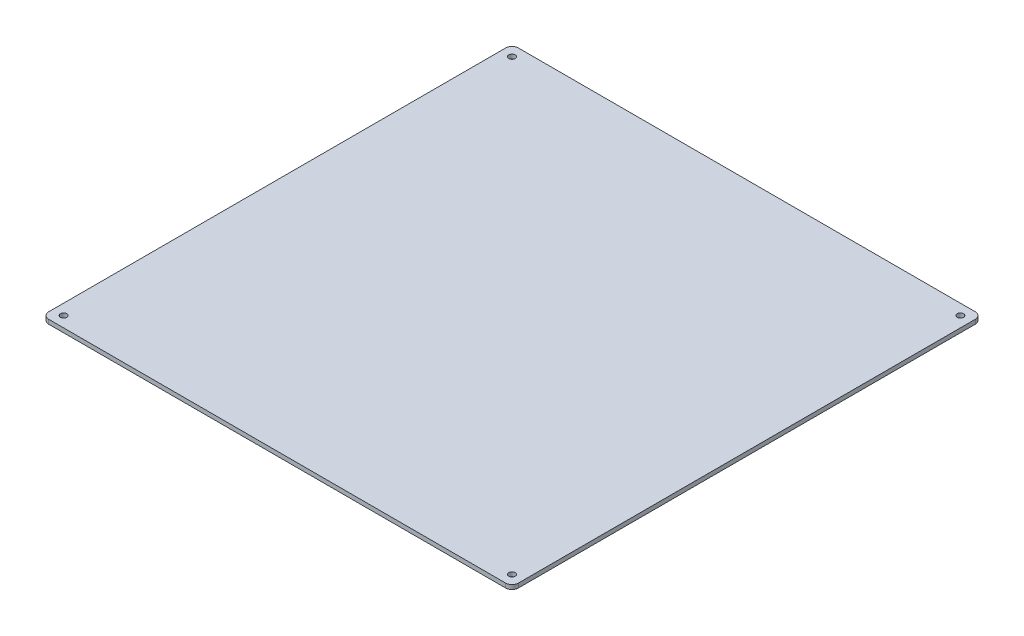
ISO-10303-21;
HEADER;
FILE_DESCRIPTION(('STEP AP214'),'2;1');
FILE_NAME('part.step','',(''),(''),'','','');
FILE_SCHEMA(('AUTOMOTIVE_DESIGN { 1 0 10303 214 1 1 1 1 }'));
ENDSEC;
DATA;
#1=APPLICATION_CONTEXT('core data for automotive mechanical design processes');
#2=APPLICATION_PROTOCOL_DEFINITION('international standard','automotive_design',2000,#1);
#3=PRODUCT_CONTEXT('',#1,'mechanical');
#4=PRODUCT('Part','Part','',(#3));
#5=PRODUCT_RELATED_PRODUCT_CATEGORY('part','',(#4));
#6=PRODUCT_DEFINITION_FORMATION('','',#4);
#7=PRODUCT_DEFINITION_CONTEXT('part definition',#1,'design');
#8=PRODUCT_DEFINITION('design','',#6,#7);
#9=PRODUCT_DEFINITION_SHAPE('','',#8);
#10=(LENGTH_UNIT() NAMED_UNIT(*) SI_UNIT(.MILLI.,.METRE.));
#11=(NAMED_UNIT(*) PLANE_ANGLE_UNIT() SI_UNIT($,.RADIAN.));
#12=(NAMED_UNIT(*) SI_UNIT($,.STERADIAN.) SOLID_ANGLE_UNIT());
#13=UNCERTAINTY_MEASURE_WITH_UNIT(LENGTH_MEASURE(1.E-05),#10,'distance_accuracy_value','');
#14=(GEOMETRIC_REPRESENTATION_CONTEXT(3) GLOBAL_UNCERTAINTY_ASSIGNED_CONTEXT((#13)) GLOBAL_UNIT_ASSIGNED_CONTEXT((#10,
#11,#12)) REPRESENTATION_CONTEXT('',''));
#15=CARTESIAN_POINT('',(0.,0.,0.));
#16=DIRECTION('',(0.,0.,1.));
#17=DIRECTION('',(1.,0.,0.));
#18=AXIS2_PLACEMENT_3D('',#15,#16,#17);
#19=CARTESIAN_POINT('',(0.,2.,0.));
#20=DIRECTION('',(0.,-1.,0.));
#21=DIRECTION('',(0.,0.,-1.));
#22=AXIS2_PLACEMENT_3D('',#19,#20,#21);
#23=PLANE('',#22);
#24=DIRECTION('',(-1.,0.,0.));
#25=VECTOR('',#24,1.);
#26=CARTESIAN_POINT('',(-109.5,2.,-109.5));
#27=LINE('',#26,#25);
#28=CARTESIAN_POINT('',(106.5,2.,-109.5));
#29=VERTEX_POINT('',#28);
#30=CARTESIAN_POINT('',(-106.5,2.,-109.5));
#31=VERTEX_POINT('',#30);
#32=EDGE_CURVE('E167',#29,#31,#27,.T.);
#33=ORIENTED_EDGE('',*,*,#32,.T.);
#34=CARTESIAN_POINT('',(-106.5,2.,-106.5));
#35=DIRECTION('',(0.,-1.,0.));
#36=DIRECTION('',(0.,0.,-1.));
#37=AXIS2_PLACEMENT_3D('',#34,#35,#36);
#38=CIRCLE('',#37,3.);
#39=CARTESIAN_POINT('',(-109.5,2.,-106.5));
#40=VERTEX_POINT('',#39);
#41=EDGE_CURVE('E147',#31,#40,#38,.F.);
#42=ORIENTED_EDGE('',*,*,#41,.T.);
#43=DIRECTION('',(0.,0.,1.));
#44=VECTOR('',#43,1.);
#45=CARTESIAN_POINT('',(-109.5,2.,109.5));
#46=LINE('',#45,#44);
#47=CARTESIAN_POINT('',(-109.5,2.,106.5));
#48=VERTEX_POINT('',#47);
#49=EDGE_CURVE('E117',#40,#48,#46,.T.);
#50=ORIENTED_EDGE('',*,*,#49,.T.);
#51=CARTESIAN_POINT('',(-106.5,2.,106.5));
#52=DIRECTION('',(0.,-1.,0.));
#53=DIRECTION('',(0.,0.,-1.));
#54=AXIS2_PLACEMENT_3D('',#51,#52,#53);
#55=CIRCLE('',#54,3.);
#56=CARTESIAN_POINT('',(-106.5,2.,109.5));
#57=VERTEX_POINT('',#56);
#58=EDGE_CURVE('E53',#48,#57,#55,.F.);
#59=ORIENTED_EDGE('',*,*,#58,.T.);
#60=DIRECTION('',(1.,0.,0.));
#61=VECTOR('',#60,1.);
#62=CARTESIAN_POINT('',(-109.5,2.,109.5));
#63=LINE('',#62,#61);
#64=CARTESIAN_POINT('',(106.5,2.,109.5));
#65=VERTEX_POINT('',#64);
#66=EDGE_CURVE('E134',#57,#65,#63,.T.);
#67=ORIENTED_EDGE('',*,*,#66,.T.);
#68=CARTESIAN_POINT('',(106.5,2.,106.5));
#69=DIRECTION('',(0.,-1.,0.));
#70=DIRECTION('',(0.,0.,-1.));
#71=AXIS2_PLACEMENT_3D('',#68,#69,#70);
#72=CIRCLE('',#71,3.);
#73=CARTESIAN_POINT('',(109.5,2.,106.5));
#74=VERTEX_POINT('',#73);
#75=EDGE_CURVE('E142',#65,#74,#72,.F.);
#76=ORIENTED_EDGE('',*,*,#75,.T.);
#77=DIRECTION('',(0.,0.,-1.));
#78=VECTOR('',#77,1.);
#79=CARTESIAN_POINT('',(109.5,2.,109.5));
#80=LINE('',#79,#78);
#81=CARTESIAN_POINT('',(109.5,2.,-106.5));
#82=VERTEX_POINT('',#81);
#83=EDGE_CURVE('E128',#74,#82,#80,.T.);
#84=ORIENTED_EDGE('',*,*,#83,.T.);
#85=CARTESIAN_POINT('',(106.5,2.,-106.5));
#86=DIRECTION('',(0.,-1.,0.));
#87=DIRECTION('',(0.,0.,-1.));
#88=AXIS2_PLACEMENT_3D('',#85,#86,#87);
#89=CIRCLE('',#88,3.);
#90=EDGE_CURVE('E145',#82,#29,#89,.F.);
#91=ORIENTED_EDGE('',*,*,#90,.T.);
#92=EDGE_LOOP('',(#33,#42,#50,#59,#67,#76,#84,#91));
#93=FACE_BOUND('',#92,.T.);
#94=CARTESIAN_POINT('',(-104.5,2.,-104.5));
#95=DIRECTION('',(0.,1.,0.));
#96=DIRECTION('',(0.,0.,1.));
#97=AXIS2_PLACEMENT_3D('',#94,#95,#96);
#98=CIRCLE('',#97,1.5);
#99=CARTESIAN_POINT('',(-104.5,2.,-103.));
#100=VERTEX_POINT('',#99);
#101=EDGE_CURVE('E173',#100,#100,#98,.T.);
#102=ORIENTED_EDGE('',*,*,#101,.F.);
#103=EDGE_LOOP('',(#102));
#104=FACE_BOUND('',#103,.T.);
#105=CARTESIAN_POINT('',(-104.5,2.,104.5));
#106=DIRECTION('',(0.,1.,0.));
#107=DIRECTION('',(0.,0.,-1.));
#108=AXIS2_PLACEMENT_3D('',#105,#106,#107);
#109=CIRCLE('',#108,1.5);
#110=CARTESIAN_POINT('',(-104.5,2.,103.));
#111=VERTEX_POINT('',#110);
#112=EDGE_CURVE('E182',#111,#111,#109,.T.);
#113=ORIENTED_EDGE('',*,*,#112,.F.);
#114=EDGE_LOOP('',(#113));
#115=FACE_BOUND('',#114,.T.);
#116=CARTESIAN_POINT('',(104.5,2.,104.5));
#117=DIRECTION('',(0.,1.,0.));
#118=DIRECTION('',(0.,0.,1.));
#119=AXIS2_PLACEMENT_3D('',#116,#117,#118);
#120=CIRCLE('',#119,1.5);
#121=CARTESIAN_POINT('',(104.5,2.,106.));
#122=VERTEX_POINT('',#121);
#123=EDGE_CURVE('E187',#122,#122,#120,.T.);
#124=ORIENTED_EDGE('',*,*,#123,.F.);
#125=EDGE_LOOP('',(#124));
#126=FACE_BOUND('',#125,.T.);
#127=CARTESIAN_POINT('',(104.5,2.,-104.5));
#128=DIRECTION('',(0.,1.,0.));
#129=DIRECTION('',(0.,0.,-1.));
#130=AXIS2_PLACEMENT_3D('',#127,#128,#129);
#131=CIRCLE('',#130,1.5);
#132=CARTESIAN_POINT('',(104.5,2.,-106.));
#133=VERTEX_POINT('',#132);
#134=EDGE_CURVE('E193',#133,#133,#131,.T.);
#135=ORIENTED_EDGE('',*,*,#134,.F.);
#136=EDGE_LOOP('',(#135));
#137=FACE_BOUND('',#136,.T.);
#138=ADVANCED_FACE('F32',(#93,#104,#115,#126,#137),#23,.F.);
#139=CARTESIAN_POINT('',(0.,0.,0.));
#140=DIRECTION('',(0.,-1.,0.));
#141=DIRECTION('',(0.,0.,-1.));
#142=AXIS2_PLACEMENT_3D('',#139,#140,#141);
#143=PLANE('',#142);
#144=CARTESIAN_POINT('',(104.5,0.,104.5));
#145=DIRECTION('',(0.,1.,0.));
#146=DIRECTION('',(0.,0.,1.));
#147=AXIS2_PLACEMENT_3D('',#144,#145,#146);
#148=CIRCLE('',#147,1.5);
#149=CARTESIAN_POINT('',(104.5,0.,106.));
#150=VERTEX_POINT('',#149);
#151=EDGE_CURVE('E190',#150,#150,#148,.T.);
#152=ORIENTED_EDGE('',*,*,#151,.T.);
#153=EDGE_LOOP('',(#152));
#154=FACE_BOUND('',#153,.T.);
#155=CARTESIAN_POINT('',(-104.5,0.,-104.5));
#156=DIRECTION('',(0.,1.,0.));
#157=DIRECTION('',(0.,0.,1.));
#158=AXIS2_PLACEMENT_3D('',#155,#156,#157);
#159=CIRCLE('',#158,1.5);
#160=CARTESIAN_POINT('',(-104.5,0.,-103.));
#161=VERTEX_POINT('',#160);
#162=EDGE_CURVE('E175',#161,#161,#159,.T.);
#163=ORIENTED_EDGE('',*,*,#162,.T.);
#164=EDGE_LOOP('',(#163));
#165=FACE_BOUND('',#164,.T.);
#166=DIRECTION('',(0.,0.,1.));
#167=VECTOR('',#166,1.);
#168=CARTESIAN_POINT('',(-109.5,0.,109.5));
#169=LINE('',#168,#167);
#170=CARTESIAN_POINT('',(-109.5,0.,-106.5));
#171=VERTEX_POINT('',#170);
#172=CARTESIAN_POINT('',(-109.5,0.,106.5));
#173=VERTEX_POINT('',#172);
#174=EDGE_CURVE('E115',#171,#173,#169,.T.);
#175=ORIENTED_EDGE('',*,*,#174,.F.);
#176=CARTESIAN_POINT('',(-106.5,0.,-106.5));
#177=DIRECTION('',(0.,-1.,0.));
#178=DIRECTION('',(0.,0.,-1.));
#179=AXIS2_PLACEMENT_3D('',#176,#177,#178);
#180=CIRCLE('',#179,3.);
#181=CARTESIAN_POINT('',(-106.5,0.,-109.5));
#182=VERTEX_POINT('',#181);
#183=EDGE_CURVE('E98',#171,#182,#180,.T.);
#184=ORIENTED_EDGE('',*,*,#183,.T.);
#185=DIRECTION('',(-1.,0.,0.));
#186=VECTOR('',#185,1.);
#187=CARTESIAN_POINT('',(-109.5,0.,-109.5));
#188=LINE('',#187,#186);
#189=CARTESIAN_POINT('',(106.5,0.,-109.5));
#190=VERTEX_POINT('',#189);
#191=EDGE_CURVE('E126',#190,#182,#188,.T.);
#192=ORIENTED_EDGE('',*,*,#191,.F.);
#193=CARTESIAN_POINT('',(106.5,0.,-106.5));
#194=DIRECTION('',(0.,-1.,0.));
#195=DIRECTION('',(0.,0.,-1.));
#196=AXIS2_PLACEMENT_3D('',#193,#194,#195);
#197=CIRCLE('',#196,3.);
#198=CARTESIAN_POINT('',(109.5,0.,-106.5));
#199=VERTEX_POINT('',#198);
#200=EDGE_CURVE('E109',#190,#199,#197,.T.);
#201=ORIENTED_EDGE('',*,*,#200,.T.);
#202=DIRECTION('',(0.,0.,-1.));
#203=VECTOR('',#202,1.);
#204=CARTESIAN_POINT('',(109.5,0.,109.5));
#205=LINE('',#204,#203);
#206=CARTESIAN_POINT('',(109.5,0.,106.5));
#207=VERTEX_POINT('',#206);
#208=EDGE_CURVE('E130',#207,#199,#205,.T.);
#209=ORIENTED_EDGE('',*,*,#208,.F.);
#210=CARTESIAN_POINT('',(106.5,0.,106.5));
#211=DIRECTION('',(0.,-1.,0.));
#212=DIRECTION('',(0.,0.,-1.));
#213=AXIS2_PLACEMENT_3D('',#210,#211,#212);
#214=CIRCLE('',#213,3.);
#215=CARTESIAN_POINT('',(106.5,0.,109.5));
#216=VERTEX_POINT('',#215);
#217=EDGE_CURVE('E118',#207,#216,#214,.T.);
#218=ORIENTED_EDGE('',*,*,#217,.T.);
#219=DIRECTION('',(1.,0.,0.));
#220=VECTOR('',#219,1.);
#221=CARTESIAN_POINT('',(-109.5,0.,109.5));
#222=LINE('',#221,#220);
#223=CARTESIAN_POINT('',(-106.5,0.,109.5));
#224=VERTEX_POINT('',#223);
#225=EDGE_CURVE('E125',#224,#216,#222,.T.);
#226=ORIENTED_EDGE('',*,*,#225,.F.);
#227=CARTESIAN_POINT('',(-106.5,0.,106.5));
#228=DIRECTION('',(0.,-1.,0.));
#229=DIRECTION('',(0.,0.,-1.));
#230=AXIS2_PLACEMENT_3D('',#227,#228,#229);
#231=CIRCLE('',#230,3.);
#232=EDGE_CURVE('E124',#224,#173,#231,.T.);
#233=ORIENTED_EDGE('',*,*,#232,.T.);
#234=EDGE_LOOP('',(#175,#184,#192,#201,#209,#218,#226,#233));
#235=FACE_BOUND('',#234,.T.);
#236=CARTESIAN_POINT('',(-104.5,0.,104.5));
#237=DIRECTION('',(0.,1.,0.));
#238=DIRECTION('',(0.,0.,-1.));
#239=AXIS2_PLACEMENT_3D('',#236,#237,#238);
#240=CIRCLE('',#239,1.5);
#241=CARTESIAN_POINT('',(-104.5,0.,103.));
#242=VERTEX_POINT('',#241);
#243=EDGE_CURVE('E184',#242,#242,#240,.T.);
#244=ORIENTED_EDGE('',*,*,#243,.T.);
#245=EDGE_LOOP('',(#244));
#246=FACE_BOUND('',#245,.T.);
#247=CARTESIAN_POINT('',(104.5,0.,-104.5));
#248=DIRECTION('',(0.,1.,0.));
#249=DIRECTION('',(0.,0.,-1.));
#250=AXIS2_PLACEMENT_3D('',#247,#248,#249);
#251=CIRCLE('',#250,1.5);
#252=CARTESIAN_POINT('',(104.5,0.,-106.));
#253=VERTEX_POINT('',#252);
#254=EDGE_CURVE('E196',#253,#253,#251,.T.);
#255=ORIENTED_EDGE('',*,*,#254,.T.);
#256=EDGE_LOOP('',(#255));
#257=FACE_BOUND('',#256,.T.);
#258=ADVANCED_FACE('F121',(#154,#165,#235,#246,#257),#143,.T.);
#259=CARTESIAN_POINT('',(109.5,2.,109.5));
#260=DIRECTION('',(-1.,0.,0.));
#261=DIRECTION('',(0.,0.,1.));
#262=AXIS2_PLACEMENT_3D('',#259,#260,#261);
#263=PLANE('',#262);
#264=ORIENTED_EDGE('',*,*,#208,.T.);
#265=DIRECTION('',(0.,-1.,0.));
#266=VECTOR('',#265,1.);
#267=CARTESIAN_POINT('',(109.5,2.,-106.5));
#268=LINE('',#267,#266);
#269=EDGE_CURVE('E152',#199,#82,#268,.F.);
#270=ORIENTED_EDGE('',*,*,#269,.T.);
#271=ORIENTED_EDGE('',*,*,#83,.F.);
#272=DIRECTION('',(0.,-1.,0.));
#273=VECTOR('',#272,1.);
#274=CARTESIAN_POINT('',(109.5,2.,106.5));
#275=LINE('',#274,#273);
#276=EDGE_CURVE('E149',#74,#207,#275,.T.);
#277=ORIENTED_EDGE('',*,*,#276,.T.);
#278=EDGE_LOOP('',(#264,#270,#271,#277));
#279=FACE_BOUND('',#278,.T.);
#280=ADVANCED_FACE('F158',(#279),#263,.F.);
#281=CARTESIAN_POINT('',(-109.5,2.,-109.5));
#282=DIRECTION('',(0.,0.,1.));
#283=DIRECTION('',(1.,0.,0.));
#284=AXIS2_PLACEMENT_3D('',#281,#282,#283);
#285=PLANE('',#284);
#286=ORIENTED_EDGE('',*,*,#191,.T.);
#287=DIRECTION('',(0.,-1.,0.));
#288=VECTOR('',#287,1.);
#289=CARTESIAN_POINT('',(-106.5,2.,-109.5));
#290=LINE('',#289,#288);
#291=EDGE_CURVE('E103',#182,#31,#290,.F.);
#292=ORIENTED_EDGE('',*,*,#291,.T.);
#293=ORIENTED_EDGE('',*,*,#32,.F.);
#294=DIRECTION('',(0.,-1.,0.));
#295=VECTOR('',#294,1.);
#296=CARTESIAN_POINT('',(106.5,2.,-109.5));
#297=LINE('',#296,#295);
#298=EDGE_CURVE('E108',#29,#190,#297,.T.);
#299=ORIENTED_EDGE('',*,*,#298,.T.);
#300=EDGE_LOOP('',(#286,#292,#293,#299));
#301=FACE_BOUND('',#300,.T.);
#302=ADVANCED_FACE('F172',(#301),#285,.F.);
#303=CARTESIAN_POINT('',(-109.5,2.,109.5));
#304=DIRECTION('',(1.,0.,0.));
#305=DIRECTION('',(0.,0.,-1.));
#306=AXIS2_PLACEMENT_3D('',#303,#304,#305);
#307=PLANE('',#306);
#308=ORIENTED_EDGE('',*,*,#49,.F.);
#309=DIRECTION('',(0.,-1.,0.));
#310=VECTOR('',#309,1.);
#311=CARTESIAN_POINT('',(-109.5,2.,-106.5));
#312=LINE('',#311,#310);
#313=EDGE_CURVE('E102',#40,#171,#312,.T.);
#314=ORIENTED_EDGE('',*,*,#313,.T.);
#315=ORIENTED_EDGE('',*,*,#174,.T.);
#316=DIRECTION('',(0.,-1.,0.));
#317=VECTOR('',#316,1.);
#318=CARTESIAN_POINT('',(-109.5,2.,106.5));
#319=LINE('',#318,#317);
#320=EDGE_CURVE('E119',#173,#48,#319,.F.);
#321=ORIENTED_EDGE('',*,*,#320,.T.);
#322=EDGE_LOOP('',(#308,#314,#315,#321));
#323=FACE_BOUND('',#322,.T.);
#324=ADVANCED_FACE('F114',(#323),#307,.F.);
#325=CARTESIAN_POINT('',(-109.5,2.,109.5));
#326=DIRECTION('',(0.,0.,-1.));
#327=DIRECTION('',(-1.,0.,0.));
#328=AXIS2_PLACEMENT_3D('',#325,#326,#327);
#329=PLANE('',#328);
#330=ORIENTED_EDGE('',*,*,#66,.F.);
#331=DIRECTION('',(0.,-1.,0.));
#332=VECTOR('',#331,1.);
#333=CARTESIAN_POINT('',(-106.5,2.,109.5));
#334=LINE('',#333,#332);
#335=EDGE_CURVE('E11',#57,#224,#334,.T.);
#336=ORIENTED_EDGE('',*,*,#335,.T.);
#337=ORIENTED_EDGE('',*,*,#225,.T.);
#338=DIRECTION('',(0.,-1.,0.));
#339=VECTOR('',#338,1.);
#340=CARTESIAN_POINT('',(106.5,2.,109.5));
#341=LINE('',#340,#339);
#342=EDGE_CURVE('E40',#216,#65,#341,.F.);
#343=ORIENTED_EDGE('',*,*,#342,.T.);
#344=EDGE_LOOP('',(#330,#336,#337,#343));
#345=FACE_BOUND('',#344,.T.);
#346=ADVANCED_FACE('F216',(#345),#329,.F.);
#347=CARTESIAN_POINT('',(-104.5,2.,-104.5));
#348=DIRECTION('',(0.,-1.,0.));
#349=DIRECTION('',(0.,0.,-1.));
#350=AXIS2_PLACEMENT_3D('',#347,#348,#349);
#351=CYLINDRICAL_SURFACE('',#350,1.5);
#352=ORIENTED_EDGE('',*,*,#101,.T.);
#353=EDGE_LOOP('',(#352));
#354=FACE_BOUND('',#353,.T.);
#355=ORIENTED_EDGE('',*,*,#162,.F.);
#356=EDGE_LOOP('',(#355));
#357=FACE_BOUND('',#356,.T.);
#358=ADVANCED_FACE('F213',(#354,#357),#351,.F.);
#359=CARTESIAN_POINT('',(-104.5,2.,104.5));
#360=DIRECTION('',(0.,-1.,0.));
#361=DIRECTION('',(0.,0.,-1.));
#362=AXIS2_PLACEMENT_3D('',#359,#360,#361);
#363=CYLINDRICAL_SURFACE('',#362,1.5);
#364=ORIENTED_EDGE('',*,*,#112,.T.);
#365=EDGE_LOOP('',(#364));
#366=FACE_BOUND('',#365,.T.);
#367=ORIENTED_EDGE('',*,*,#243,.F.);
#368=EDGE_LOOP('',(#367));
#369=FACE_BOUND('',#368,.T.);
#370=ADVANCED_FACE('F308',(#366,#369),#363,.F.);
#371=CARTESIAN_POINT('',(104.5,2.,104.5));
#372=DIRECTION('',(0.,-1.,0.));
#373=DIRECTION('',(0.,0.,-1.));
#374=AXIS2_PLACEMENT_3D('',#371,#372,#373);
#375=CYLINDRICAL_SURFACE('',#374,1.5);
#376=ORIENTED_EDGE('',*,*,#123,.T.);
#377=EDGE_LOOP('',(#376));
#378=FACE_BOUND('',#377,.T.);
#379=ORIENTED_EDGE('',*,*,#151,.F.);
#380=EDGE_LOOP('',(#379));
#381=FACE_BOUND('',#380,.T.);
#382=ADVANCED_FACE('F299',(#378,#381),#375,.F.);
#383=CARTESIAN_POINT('',(104.5,2.,-104.5));
#384=DIRECTION('',(0.,-1.,0.));
#385=DIRECTION('',(0.,0.,-1.));
#386=AXIS2_PLACEMENT_3D('',#383,#384,#385);
#387=CYLINDRICAL_SURFACE('',#386,1.5);
#388=ORIENTED_EDGE('',*,*,#134,.T.);
#389=EDGE_LOOP('',(#388));
#390=FACE_BOUND('',#389,.T.);
#391=ORIENTED_EDGE('',*,*,#254,.F.);
#392=EDGE_LOOP('',(#391));
#393=FACE_BOUND('',#392,.T.);
#394=ADVANCED_FACE('F202',(#390,#393),#387,.F.);
#395=CARTESIAN_POINT('',(-106.5,2.,-106.5));
#396=DIRECTION('',(0.,-1.,0.));
#397=DIRECTION('',(0.,0.,-1.));
#398=AXIS2_PLACEMENT_3D('',#395,#396,#397);
#399=CYLINDRICAL_SURFACE('',#398,3.);
#400=ORIENTED_EDGE('',*,*,#41,.F.);
#401=ORIENTED_EDGE('',*,*,#291,.F.);
#402=ORIENTED_EDGE('',*,*,#183,.F.);
#403=ORIENTED_EDGE('',*,*,#313,.F.);
#404=EDGE_LOOP('',(#400,#401,#402,#403));
#405=FACE_BOUND('',#404,.T.);
#406=ADVANCED_FACE('F101',(#405),#399,.T.);
#407=CARTESIAN_POINT('',(106.5,2.,-106.5));
#408=DIRECTION('',(0.,-1.,0.));
#409=DIRECTION('',(0.,0.,-1.));
#410=AXIS2_PLACEMENT_3D('',#407,#408,#409);
#411=CYLINDRICAL_SURFACE('',#410,3.);
#412=ORIENTED_EDGE('',*,*,#90,.F.);
#413=ORIENTED_EDGE('',*,*,#269,.F.);
#414=ORIENTED_EDGE('',*,*,#200,.F.);
#415=ORIENTED_EDGE('',*,*,#298,.F.);
#416=EDGE_LOOP('',(#412,#413,#414,#415));
#417=FACE_BOUND('',#416,.T.);
#418=ADVANCED_FACE('F170',(#417),#411,.T.);
#419=CARTESIAN_POINT('',(-106.5,2.,106.5));
#420=DIRECTION('',(0.,-1.,0.));
#421=DIRECTION('',(0.,0.,-1.));
#422=AXIS2_PLACEMENT_3D('',#419,#420,#421);
#423=CYLINDRICAL_SURFACE('',#422,3.);
#424=ORIENTED_EDGE('',*,*,#58,.F.);
#425=ORIENTED_EDGE('',*,*,#320,.F.);
#426=ORIENTED_EDGE('',*,*,#232,.F.);
#427=ORIENTED_EDGE('',*,*,#335,.F.);
#428=EDGE_LOOP('',(#424,#425,#426,#427));
#429=FACE_BOUND('',#428,.T.);
#430=ADVANCED_FACE('F228',(#429),#423,.T.);
#431=CARTESIAN_POINT('',(106.5,2.,106.5));
#432=DIRECTION('',(0.,-1.,0.));
#433=DIRECTION('',(0.,0.,-1.));
#434=AXIS2_PLACEMENT_3D('',#431,#432,#433);
#435=CYLINDRICAL_SURFACE('',#434,3.);
#436=ORIENTED_EDGE('',*,*,#75,.F.);
#437=ORIENTED_EDGE('',*,*,#342,.F.);
#438=ORIENTED_EDGE('',*,*,#217,.F.);
#439=ORIENTED_EDGE('',*,*,#276,.F.);
#440=EDGE_LOOP('',(#436,#437,#438,#439));
#441=FACE_BOUND('',#440,.T.);
#442=ADVANCED_FACE('F34',(#441),#435,.T.);
#443=CLOSED_SHELL('',(#138,#258,#280,#302,#324,#346,#358,#370,#382,#394,#406,#418,#430,#442));
#444=MANIFOLD_SOLID_BREP('B2',#443);
#445=ADVANCED_BREP_SHAPE_REPRESENTATION('',(#18,#444),#14);
#446=SHAPE_DEFINITION_REPRESENTATION(#9,#445);
ENDSEC;
END-ISO-10303-21;
